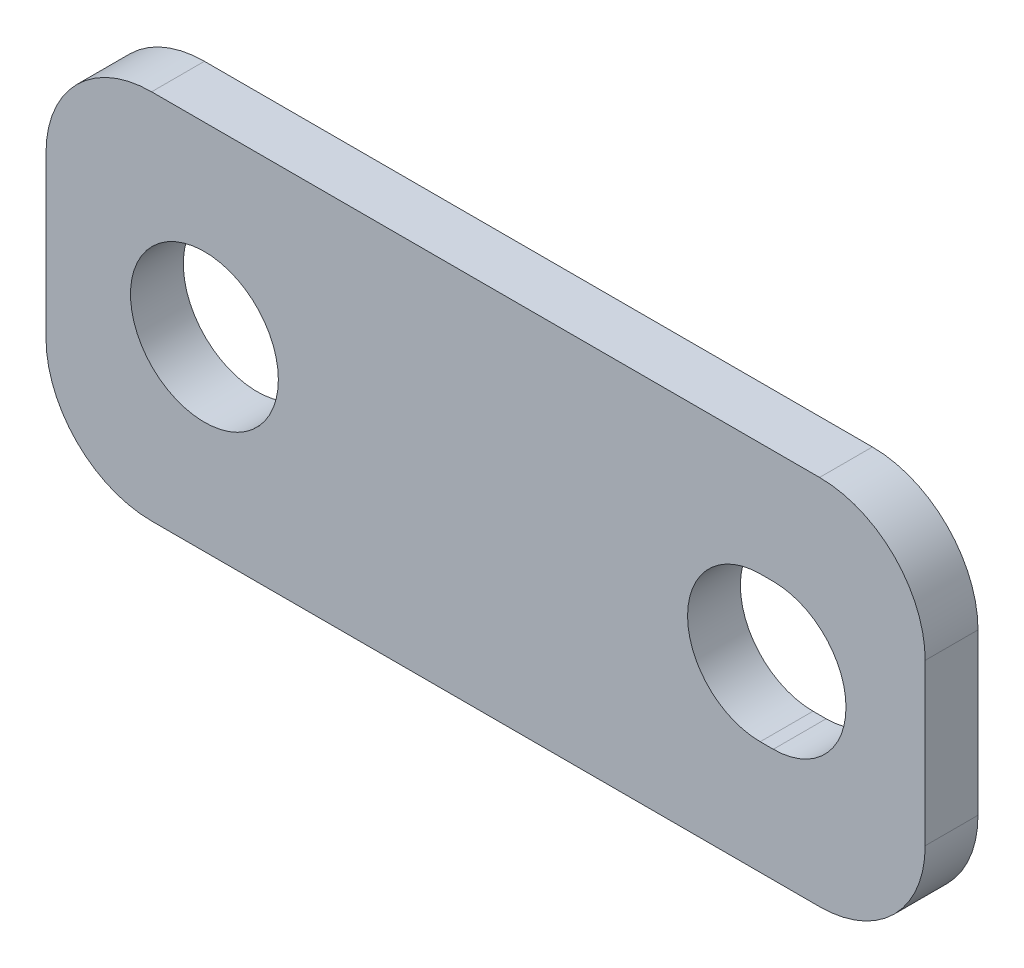
ISO-10303-21;
HEADER;
FILE_DESCRIPTION(('STEP AP214'),'2;1');
FILE_NAME('part.step','',(''),(''),'','','');
FILE_SCHEMA(('AUTOMOTIVE_DESIGN { 1 0 10303 214 1 1 1 1 }'));
ENDSEC;
DATA;
#1=APPLICATION_CONTEXT('core data for automotive mechanical design processes');
#2=APPLICATION_PROTOCOL_DEFINITION('international standard','automotive_design',2000,#1);
#3=PRODUCT_CONTEXT('',#1,'mechanical');
#4=PRODUCT('Part','Part','',(#3));
#5=PRODUCT_RELATED_PRODUCT_CATEGORY('part','',(#4));
#6=PRODUCT_DEFINITION_FORMATION('','',#4);
#7=PRODUCT_DEFINITION_CONTEXT('part definition',#1,'design');
#8=PRODUCT_DEFINITION('design','',#6,#7);
#9=PRODUCT_DEFINITION_SHAPE('','',#8);
#10=(LENGTH_UNIT() NAMED_UNIT(*) SI_UNIT(.MILLI.,.METRE.));
#11=(NAMED_UNIT(*) PLANE_ANGLE_UNIT() SI_UNIT($,.RADIAN.));
#12=(NAMED_UNIT(*) SI_UNIT($,.STERADIAN.) SOLID_ANGLE_UNIT());
#13=UNCERTAINTY_MEASURE_WITH_UNIT(LENGTH_MEASURE(1.E-05),#10,'distance_accuracy_value','');
#14=(GEOMETRIC_REPRESENTATION_CONTEXT(3) GLOBAL_UNCERTAINTY_ASSIGNED_CONTEXT((#13)) GLOBAL_UNIT_ASSIGNED_CONTEXT((#10,
#11,#12)) REPRESENTATION_CONTEXT('',''));
#15=CARTESIAN_POINT('',(0.,0.,0.));
#16=DIRECTION('',(0.,0.,1.));
#17=DIRECTION('',(1.,0.,0.));
#18=AXIS2_PLACEMENT_3D('',#15,#16,#17);
#19=CARTESIAN_POINT('',(0.,0.,-3.175));
#20=DIRECTION('',(-1.,0.,0.));
#21=DIRECTION('',(0.,0.,1.));
#22=AXIS2_PLACEMENT_3D('',#19,#20,#21);
#23=PLANE('',#22);
#24=DIRECTION('',(0.,-1.,0.));
#25=VECTOR('',#24,1.);
#26=CARTESIAN_POINT('',(0.,0.,0.));
#27=LINE('',#26,#25);
#28=CARTESIAN_POINT('',(0.,16.002,0.));
#29=VERTEX_POINT('',#28);
#30=CARTESIAN_POINT('',(0.,6.35,0.));
#31=VERTEX_POINT('',#30);
#32=EDGE_CURVE('E169',#29,#31,#27,.T.);
#33=ORIENTED_EDGE('',*,*,#32,.F.);
#34=DIRECTION('',(0.,0.,1.));
#35=VECTOR('',#34,1.);
#36=CARTESIAN_POINT('',(0.,16.002,-3.175));
#37=LINE('',#36,#35);
#38=CARTESIAN_POINT('',(0.,16.002,-3.175));
#39=VERTEX_POINT('',#38);
#40=EDGE_CURVE('E11',#29,#39,#37,.F.);
#41=ORIENTED_EDGE('',*,*,#40,.T.);
#42=DIRECTION('',(0.,-1.,0.));
#43=VECTOR('',#42,1.);
#44=CARTESIAN_POINT('',(0.,0.,-3.175));
#45=LINE('',#44,#43);
#46=CARTESIAN_POINT('',(0.,6.35,-3.175));
#47=VERTEX_POINT('',#46);
#48=EDGE_CURVE('E178',#39,#47,#45,.T.);
#49=ORIENTED_EDGE('',*,*,#48,.T.);
#50=DIRECTION('',(0.,0.,1.));
#51=VECTOR('',#50,1.);
#52=CARTESIAN_POINT('',(0.,6.35,-3.175));
#53=LINE('',#52,#51);
#54=EDGE_CURVE('E46',#47,#31,#53,.T.);
#55=ORIENTED_EDGE('',*,*,#54,.T.);
#56=EDGE_LOOP('',(#33,#41,#49,#55));
#57=FACE_BOUND('',#56,.T.);
#58=ADVANCED_FACE('F38',(#57),#23,.T.);
#59=CARTESIAN_POINT('',(0.,22.352,-3.175));
#60=DIRECTION('',(0.,1.,0.));
#61=DIRECTION('',(0.,0.,1.));
#62=AXIS2_PLACEMENT_3D('',#59,#60,#61);
#63=PLANE('',#62);
#64=DIRECTION('',(-1.,0.,0.));
#65=VECTOR('',#64,1.);
#66=CARTESIAN_POINT('',(0.,22.352,0.));
#67=LINE('',#66,#65);
#68=CARTESIAN_POINT('',(46.5123999999572,22.352,0.));
#69=VERTEX_POINT('',#68);
#70=CARTESIAN_POINT('',(6.35,22.352,0.));
#71=VERTEX_POINT('',#70);
#72=EDGE_CURVE('E182',#69,#71,#67,.T.);
#73=ORIENTED_EDGE('',*,*,#72,.F.);
#74=DIRECTION('',(0.,0.,1.));
#75=VECTOR('',#74,1.);
#76=CARTESIAN_POINT('',(46.5123999999572,22.352,-3.175));
#77=LINE('',#76,#75);
#78=CARTESIAN_POINT('',(46.5123999999572,22.352,-3.175));
#79=VERTEX_POINT('',#78);
#80=EDGE_CURVE('E216',#69,#79,#77,.F.);
#81=ORIENTED_EDGE('',*,*,#80,.T.);
#82=DIRECTION('',(-1.,0.,0.));
#83=VECTOR('',#82,1.);
#84=CARTESIAN_POINT('',(0.,22.352,-3.175));
#85=LINE('',#84,#83);
#86=CARTESIAN_POINT('',(6.35,22.352,-3.175));
#87=VERTEX_POINT('',#86);
#88=EDGE_CURVE('E187',#79,#87,#85,.T.);
#89=ORIENTED_EDGE('',*,*,#88,.T.);
#90=DIRECTION('',(0.,0.,1.));
#91=VECTOR('',#90,1.);
#92=CARTESIAN_POINT('',(6.35,22.352,-3.175));
#93=LINE('',#92,#91);
#94=EDGE_CURVE('E213',#87,#71,#93,.T.);
#95=ORIENTED_EDGE('',*,*,#94,.T.);
#96=EDGE_LOOP('',(#73,#81,#89,#95));
#97=FACE_BOUND('',#96,.T.);
#98=ADVANCED_FACE('F244',(#97),#63,.T.);
#99=CARTESIAN_POINT('',(52.8623999999572,0.,-3.175));
#100=DIRECTION('',(1.,0.,0.));
#101=DIRECTION('',(0.,0.,-1.));
#102=AXIS2_PLACEMENT_3D('',#99,#100,#101);
#103=PLANE('',#102);
#104=DIRECTION('',(0.,1.,0.));
#105=VECTOR('',#104,1.);
#106=CARTESIAN_POINT('',(52.8623999999572,0.,-3.175));
#107=LINE('',#106,#105);
#108=CARTESIAN_POINT('',(52.8623999999572,6.35,-3.175));
#109=VERTEX_POINT('',#108);
#110=CARTESIAN_POINT('',(52.8623999999572,16.002,-3.175));
#111=VERTEX_POINT('',#110);
#112=EDGE_CURVE('E184',#109,#111,#107,.T.);
#113=ORIENTED_EDGE('',*,*,#112,.T.);
#114=DIRECTION('',(0.,0.,1.));
#115=VECTOR('',#114,1.);
#116=CARTESIAN_POINT('',(52.8623999999572,16.002,-3.175));
#117=LINE('',#116,#115);
#118=CARTESIAN_POINT('',(52.8623999999572,16.002,0.));
#119=VERTEX_POINT('',#118);
#120=EDGE_CURVE('E202',#111,#119,#117,.T.);
#121=ORIENTED_EDGE('',*,*,#120,.T.);
#122=DIRECTION('',(0.,1.,0.));
#123=VECTOR('',#122,1.);
#124=CARTESIAN_POINT('',(52.8623999999572,0.,0.));
#125=LINE('',#124,#123);
#126=CARTESIAN_POINT('',(52.8623999999572,6.35,0.));
#127=VERTEX_POINT('',#126);
#128=EDGE_CURVE('E196',#127,#119,#125,.T.);
#129=ORIENTED_EDGE('',*,*,#128,.F.);
#130=DIRECTION('',(0.,0.,1.));
#131=VECTOR('',#130,1.);
#132=CARTESIAN_POINT('',(52.8623999999572,6.35,-3.175));
#133=LINE('',#132,#131);
#134=EDGE_CURVE('E190',#127,#109,#133,.F.);
#135=ORIENTED_EDGE('',*,*,#134,.T.);
#136=EDGE_LOOP('',(#113,#121,#129,#135));
#137=FACE_BOUND('',#136,.T.);
#138=ADVANCED_FACE('F253',(#137),#103,.T.);
#139=CARTESIAN_POINT('',(0.,0.,-3.175));
#140=DIRECTION('',(0.,-1.,0.));
#141=DIRECTION('',(0.,0.,-1.));
#142=AXIS2_PLACEMENT_3D('',#139,#140,#141);
#143=PLANE('',#142);
#144=DIRECTION('',(1.,0.,0.));
#145=VECTOR('',#144,1.);
#146=CARTESIAN_POINT('',(0.,0.,-3.175));
#147=LINE('',#146,#145);
#148=CARTESIAN_POINT('',(6.35,0.,-3.175));
#149=VERTEX_POINT('',#148);
#150=CARTESIAN_POINT('',(46.5123999999572,0.,-3.175));
#151=VERTEX_POINT('',#150);
#152=EDGE_CURVE('E181',#149,#151,#147,.T.);
#153=ORIENTED_EDGE('',*,*,#152,.T.);
#154=DIRECTION('',(0.,0.,1.));
#155=VECTOR('',#154,1.);
#156=CARTESIAN_POINT('',(46.5123999999572,0.,-3.175));
#157=LINE('',#156,#155);
#158=CARTESIAN_POINT('',(46.5123999999572,0.,0.));
#159=VERTEX_POINT('',#158);
#160=EDGE_CURVE('E226',#151,#159,#157,.T.);
#161=ORIENTED_EDGE('',*,*,#160,.T.);
#162=DIRECTION('',(1.,0.,0.));
#163=VECTOR('',#162,1.);
#164=CARTESIAN_POINT('',(0.,0.,0.));
#165=LINE('',#164,#163);
#166=CARTESIAN_POINT('',(6.35,0.,0.));
#167=VERTEX_POINT('',#166);
#168=EDGE_CURVE('E193',#167,#159,#165,.T.);
#169=ORIENTED_EDGE('',*,*,#168,.F.);
#170=DIRECTION('',(0.,0.,1.));
#171=VECTOR('',#170,1.);
#172=CARTESIAN_POINT('',(6.35,0.,-3.175));
#173=LINE('',#172,#171);
#174=EDGE_CURVE('E60',#167,#149,#173,.F.);
#175=ORIENTED_EDGE('',*,*,#174,.T.);
#176=EDGE_LOOP('',(#153,#161,#169,#175));
#177=FACE_BOUND('',#176,.T.);
#178=ADVANCED_FACE('F258',(#177),#143,.T.);
#179=CARTESIAN_POINT('',(0.,0.,-3.175));
#180=DIRECTION('',(0.,0.,-1.));
#181=DIRECTION('',(-1.,0.,0.));
#182=AXIS2_PLACEMENT_3D('',#179,#180,#181);
#183=PLANE('',#182);
#184=DIRECTION('',(1.,0.,0.));
#185=VECTOR('',#184,1.);
#186=CARTESIAN_POINT('',(0.,6.80719999999018,-3.175));
#187=LINE('',#186,#185);
#188=CARTESIAN_POINT('',(42.9436999999572,6.80719999999013,-3.175));
#189=VERTEX_POINT('',#188);
#190=CARTESIAN_POINT('',(43.7310999999572,6.80719999999013,-3.175));
#191=VERTEX_POINT('',#190);
#192=EDGE_CURVE('E132',#189,#191,#187,.T.);
#193=ORIENTED_EDGE('',*,*,#192,.T.);
#194=CARTESIAN_POINT('',(43.7310999999572,11.1759999999901,-3.175));
#195=DIRECTION('',(0.,0.,1.));
#196=DIRECTION('',(1.,0.,0.));
#197=AXIS2_PLACEMENT_3D('',#194,#195,#196);
#198=CIRCLE('',#197,4.3688);
#199=CARTESIAN_POINT('',(43.7310999999572,15.5447999999901,-3.175));
#200=VERTEX_POINT('',#199);
#201=EDGE_CURVE('E144',#191,#200,#198,.T.);
#202=ORIENTED_EDGE('',*,*,#201,.T.);
#203=DIRECTION('',(-1.,0.,0.));
#204=VECTOR('',#203,1.);
#205=CARTESIAN_POINT('',(1.02740396835208E-13,15.5447999999904,-3.175));
#206=LINE('',#205,#204);
#207=CARTESIAN_POINT('',(42.9436999999572,15.5447999999901,-3.175));
#208=VERTEX_POINT('',#207);
#209=EDGE_CURVE('E148',#200,#208,#206,.T.);
#210=ORIENTED_EDGE('',*,*,#209,.T.);
#211=CARTESIAN_POINT('',(42.9436999999572,11.1759999999901,-3.175));
#212=DIRECTION('',(0.,0.,1.));
#213=DIRECTION('',(1.,0.,0.));
#214=AXIS2_PLACEMENT_3D('',#211,#212,#213);
#215=CIRCLE('',#214,4.3688);
#216=EDGE_CURVE('E140',#208,#189,#215,.T.);
#217=ORIENTED_EDGE('',*,*,#216,.T.);
#218=EDGE_LOOP('',(#193,#202,#210,#217));
#219=FACE_BOUND('',#218,.T.);
#220=CARTESIAN_POINT('',(9.525,11.176,-3.175));
#221=DIRECTION('',(0.,0.,1.));
#222=DIRECTION('',(1.,0.,0.));
#223=AXIS2_PLACEMENT_3D('',#220,#221,#222);
#224=CIRCLE('',#223,4.445);
#225=CARTESIAN_POINT('',(13.97,11.176,-3.175));
#226=VERTEX_POINT('',#225);
#227=EDGE_CURVE('E163',#226,#226,#224,.T.);
#228=ORIENTED_EDGE('',*,*,#227,.T.);
#229=EDGE_LOOP('',(#228));
#230=FACE_BOUND('',#229,.T.);
#231=ORIENTED_EDGE('',*,*,#88,.F.);
#232=CARTESIAN_POINT('',(46.5123999999572,16.002,-3.175));
#233=DIRECTION('',(0.,0.,-1.));
#234=DIRECTION('',(-1.,0.,0.));
#235=AXIS2_PLACEMENT_3D('',#232,#233,#234);
#236=CIRCLE('',#235,6.35);
#237=EDGE_CURVE('E223',#79,#111,#236,.T.);
#238=ORIENTED_EDGE('',*,*,#237,.T.);
#239=ORIENTED_EDGE('',*,*,#112,.F.);
#240=CARTESIAN_POINT('',(46.5123999999572,6.35,-3.175));
#241=DIRECTION('',(0.,0.,-1.));
#242=DIRECTION('',(-1.,0.,0.));
#243=AXIS2_PLACEMENT_3D('',#240,#241,#242);
#244=CIRCLE('',#243,6.35);
#245=EDGE_CURVE('E53',#109,#151,#244,.T.);
#246=ORIENTED_EDGE('',*,*,#245,.T.);
#247=ORIENTED_EDGE('',*,*,#152,.F.);
#248=CARTESIAN_POINT('',(6.35,6.35,-3.175));
#249=DIRECTION('',(0.,0.,-1.));
#250=DIRECTION('',(-1.,0.,0.));
#251=AXIS2_PLACEMENT_3D('',#248,#249,#250);
#252=CIRCLE('',#251,6.35);
#253=EDGE_CURVE('E218',#149,#47,#252,.T.);
#254=ORIENTED_EDGE('',*,*,#253,.T.);
#255=ORIENTED_EDGE('',*,*,#48,.F.);
#256=CARTESIAN_POINT('',(6.35,16.002,-3.175));
#257=DIRECTION('',(0.,0.,-1.));
#258=DIRECTION('',(-1.,0.,0.));
#259=AXIS2_PLACEMENT_3D('',#256,#257,#258);
#260=CIRCLE('',#259,6.35);
#261=EDGE_CURVE('E220',#39,#87,#260,.T.);
#262=ORIENTED_EDGE('',*,*,#261,.T.);
#263=EDGE_LOOP('',(#231,#238,#239,#246,#247,#254,#255,#262));
#264=FACE_BOUND('',#263,.T.);
#265=ADVANCED_FACE('F150',(#219,#230,#264),#183,.T.);
#266=CARTESIAN_POINT('',(0.,0.,0.));
#267=DIRECTION('',(0.,0.,-1.));
#268=DIRECTION('',(-1.,0.,0.));
#269=AXIS2_PLACEMENT_3D('',#266,#267,#268);
#270=PLANE('',#269);
#271=CARTESIAN_POINT('',(43.7310999999572,11.1759999999901,0.));
#272=DIRECTION('',(0.,0.,1.));
#273=DIRECTION('',(1.,0.,0.));
#274=AXIS2_PLACEMENT_3D('',#271,#272,#273);
#275=CIRCLE('',#274,4.3688);
#276=CARTESIAN_POINT('',(43.7310999999572,6.80719999999014,0.));
#277=VERTEX_POINT('',#276);
#278=CARTESIAN_POINT('',(43.7310999999572,15.5447999999901,0.));
#279=VERTEX_POINT('',#278);
#280=EDGE_CURVE('E162',#277,#279,#275,.T.);
#281=ORIENTED_EDGE('',*,*,#280,.F.);
#282=DIRECTION('',(1.,0.,0.));
#283=VECTOR('',#282,1.);
#284=CARTESIAN_POINT('',(0.,6.80719999999018,0.));
#285=LINE('',#284,#283);
#286=CARTESIAN_POINT('',(42.9436999999572,6.80719999999013,0.));
#287=VERTEX_POINT('',#286);
#288=EDGE_CURVE('E135',#287,#277,#285,.T.);
#289=ORIENTED_EDGE('',*,*,#288,.F.);
#290=CARTESIAN_POINT('',(42.9436999999572,11.1759999999901,0.));
#291=DIRECTION('',(0.,0.,1.));
#292=DIRECTION('',(1.,0.,0.));
#293=AXIS2_PLACEMENT_3D('',#290,#291,#292);
#294=CIRCLE('',#293,4.3688);
#295=CARTESIAN_POINT('',(42.9436999999572,15.5447999999901,0.));
#296=VERTEX_POINT('',#295);
#297=EDGE_CURVE('E153',#296,#287,#294,.T.);
#298=ORIENTED_EDGE('',*,*,#297,.F.);
#299=DIRECTION('',(-1.,0.,0.));
#300=VECTOR('',#299,1.);
#301=CARTESIAN_POINT('',(1.02740396835208E-13,15.5447999999904,0.));
#302=LINE('',#301,#300);
#303=EDGE_CURVE('E156',#279,#296,#302,.T.);
#304=ORIENTED_EDGE('',*,*,#303,.F.);
#305=EDGE_LOOP('',(#281,#289,#298,#304));
#306=FACE_BOUND('',#305,.T.);
#307=CARTESIAN_POINT('',(9.525,11.176,0.));
#308=DIRECTION('',(0.,0.,1.));
#309=DIRECTION('',(1.,0.,0.));
#310=AXIS2_PLACEMENT_3D('',#307,#308,#309);
#311=CIRCLE('',#310,4.445);
#312=CARTESIAN_POINT('',(13.97,11.176,0.));
#313=VERTEX_POINT('',#312);
#314=EDGE_CURVE('E175',#313,#313,#311,.T.);
#315=ORIENTED_EDGE('',*,*,#314,.F.);
#316=EDGE_LOOP('',(#315));
#317=FACE_BOUND('',#316,.T.);
#318=ORIENTED_EDGE('',*,*,#128,.T.);
#319=CARTESIAN_POINT('',(46.5123999999572,16.002,0.));
#320=DIRECTION('',(0.,0.,-1.));
#321=DIRECTION('',(-1.,0.,0.));
#322=AXIS2_PLACEMENT_3D('',#319,#320,#321);
#323=CIRCLE('',#322,6.35);
#324=EDGE_CURVE('E211',#119,#69,#323,.F.);
#325=ORIENTED_EDGE('',*,*,#324,.T.);
#326=ORIENTED_EDGE('',*,*,#72,.T.);
#327=CARTESIAN_POINT('',(6.35,16.002,0.));
#328=DIRECTION('',(0.,0.,-1.));
#329=DIRECTION('',(-1.,0.,0.));
#330=AXIS2_PLACEMENT_3D('',#327,#328,#329);
#331=CIRCLE('',#330,6.35);
#332=EDGE_CURVE('E207',#71,#29,#331,.F.);
#333=ORIENTED_EDGE('',*,*,#332,.T.);
#334=ORIENTED_EDGE('',*,*,#32,.T.);
#335=CARTESIAN_POINT('',(6.35,6.35,0.));
#336=DIRECTION('',(0.,0.,-1.));
#337=DIRECTION('',(-1.,0.,0.));
#338=AXIS2_PLACEMENT_3D('',#335,#336,#337);
#339=CIRCLE('',#338,6.35);
#340=EDGE_CURVE('E205',#31,#167,#339,.F.);
#341=ORIENTED_EDGE('',*,*,#340,.T.);
#342=ORIENTED_EDGE('',*,*,#168,.T.);
#343=CARTESIAN_POINT('',(46.5123999999572,6.35,0.));
#344=DIRECTION('',(0.,0.,-1.));
#345=DIRECTION('',(-1.,0.,0.));
#346=AXIS2_PLACEMENT_3D('',#343,#344,#345);
#347=CIRCLE('',#346,6.35);
#348=EDGE_CURVE('E209',#159,#127,#347,.F.);
#349=ORIENTED_EDGE('',*,*,#348,.T.);
#350=EDGE_LOOP('',(#318,#325,#326,#333,#334,#341,#342,#349));
#351=FACE_BOUND('',#350,.T.);
#352=ADVANCED_FACE('F237',(#306,#317,#351),#270,.F.);
#353=CARTESIAN_POINT('',(9.525,11.176,-3.175));
#354=DIRECTION('',(0.,0.,1.));
#355=DIRECTION('',(1.,0.,0.));
#356=AXIS2_PLACEMENT_3D('',#353,#354,#355);
#357=CYLINDRICAL_SURFACE('',#356,4.445);
#358=ORIENTED_EDGE('',*,*,#227,.F.);
#359=EDGE_LOOP('',(#358));
#360=FACE_BOUND('',#359,.T.);
#361=ORIENTED_EDGE('',*,*,#314,.T.);
#362=EDGE_LOOP('',(#361));
#363=FACE_BOUND('',#362,.T.);
#364=ADVANCED_FACE('F336',(#360,#363),#357,.F.);
#365=CARTESIAN_POINT('',(0.,6.80719999999018,-3.175));
#366=DIRECTION('',(0.,-1.,0.));
#367=DIRECTION('',(1.,0.,0.));
#368=AXIS2_PLACEMENT_3D('',#365,#366,#367);
#369=PLANE('',#368);
#370=ORIENTED_EDGE('',*,*,#288,.T.);
#371=DIRECTION('',(0.,0.,1.));
#372=VECTOR('',#371,1.);
#373=CARTESIAN_POINT('',(43.7310999999572,6.80719999999013,-3.175));
#374=LINE('',#373,#372);
#375=EDGE_CURVE('E128',#191,#277,#374,.T.);
#376=ORIENTED_EDGE('',*,*,#375,.F.);
#377=ORIENTED_EDGE('',*,*,#192,.F.);
#378=DIRECTION('',(0.,0.,1.));
#379=VECTOR('',#378,1.);
#380=CARTESIAN_POINT('',(42.9436999999572,6.80719999999013,-3.175));
#381=LINE('',#380,#379);
#382=EDGE_CURVE('E167',#189,#287,#381,.T.);
#383=ORIENTED_EDGE('',*,*,#382,.T.);
#384=EDGE_LOOP('',(#370,#376,#377,#383));
#385=FACE_BOUND('',#384,.T.);
#386=ADVANCED_FACE('F130',(#385),#369,.F.);
#387=CARTESIAN_POINT('',(42.9436999999572,11.1759999999901,-3.175));
#388=DIRECTION('',(0.,0.,1.));
#389=DIRECTION('',(1.,0.,0.));
#390=AXIS2_PLACEMENT_3D('',#387,#388,#389);
#391=CYLINDRICAL_SURFACE('',#390,4.3688);
#392=ORIENTED_EDGE('',*,*,#297,.T.);
#393=ORIENTED_EDGE('',*,*,#382,.F.);
#394=ORIENTED_EDGE('',*,*,#216,.F.);
#395=DIRECTION('',(0.,0.,1.));
#396=VECTOR('',#395,1.);
#397=CARTESIAN_POINT('',(42.9436999999572,15.5447999999901,-3.175));
#398=LINE('',#397,#396);
#399=EDGE_CURVE('E170',#208,#296,#398,.T.);
#400=ORIENTED_EDGE('',*,*,#399,.T.);
#401=EDGE_LOOP('',(#392,#393,#394,#400));
#402=FACE_BOUND('',#401,.T.);
#403=ADVANCED_FACE('F315',(#402),#391,.F.);
#404=CARTESIAN_POINT('',(1.02740396835208E-13,15.5447999999904,-3.175));
#405=DIRECTION('',(0.,1.,0.));
#406=DIRECTION('',(-1.,0.,0.));
#407=AXIS2_PLACEMENT_3D('',#404,#405,#406);
#408=PLANE('',#407);
#409=ORIENTED_EDGE('',*,*,#303,.T.);
#410=ORIENTED_EDGE('',*,*,#399,.F.);
#411=ORIENTED_EDGE('',*,*,#209,.F.);
#412=DIRECTION('',(0.,0.,1.));
#413=VECTOR('',#412,1.);
#414=CARTESIAN_POINT('',(43.7310999999572,15.5447999999901,-3.175));
#415=LINE('',#414,#413);
#416=EDGE_CURVE('E139',#200,#279,#415,.T.);
#417=ORIENTED_EDGE('',*,*,#416,.T.);
#418=EDGE_LOOP('',(#409,#410,#411,#417));
#419=FACE_BOUND('',#418,.T.);
#420=ADVANCED_FACE('F305',(#419),#408,.F.);
#421=CARTESIAN_POINT('',(43.7310999999572,11.1759999999901,-3.175));
#422=DIRECTION('',(0.,0.,1.));
#423=DIRECTION('',(1.,0.,0.));
#424=AXIS2_PLACEMENT_3D('',#421,#422,#423);
#425=CYLINDRICAL_SURFACE('',#424,4.3688);
#426=ORIENTED_EDGE('',*,*,#280,.T.);
#427=ORIENTED_EDGE('',*,*,#416,.F.);
#428=ORIENTED_EDGE('',*,*,#201,.F.);
#429=ORIENTED_EDGE('',*,*,#375,.T.);
#430=EDGE_LOOP('',(#426,#427,#428,#429));
#431=FACE_BOUND('',#430,.T.);
#432=ADVANCED_FACE('F145',(#431),#425,.F.);
#433=CARTESIAN_POINT('',(46.5123999999572,16.002,-3.175));
#434=DIRECTION('',(0.,0.,1.));
#435=DIRECTION('',(1.,0.,0.));
#436=AXIS2_PLACEMENT_3D('',#433,#434,#435);
#437=CYLINDRICAL_SURFACE('',#436,6.35);
#438=ORIENTED_EDGE('',*,*,#237,.F.);
#439=ORIENTED_EDGE('',*,*,#80,.F.);
#440=ORIENTED_EDGE('',*,*,#324,.F.);
#441=ORIENTED_EDGE('',*,*,#120,.F.);
#442=EDGE_LOOP('',(#438,#439,#440,#441));
#443=FACE_BOUND('',#442,.T.);
#444=ADVANCED_FACE('F250',(#443),#437,.T.);
#445=CARTESIAN_POINT('',(46.5123999999572,6.35,-3.175));
#446=DIRECTION('',(0.,0.,1.));
#447=DIRECTION('',(1.,0.,0.));
#448=AXIS2_PLACEMENT_3D('',#445,#446,#447);
#449=CYLINDRICAL_SURFACE('',#448,6.35);
#450=ORIENTED_EDGE('',*,*,#245,.F.);
#451=ORIENTED_EDGE('',*,*,#134,.F.);
#452=ORIENTED_EDGE('',*,*,#348,.F.);
#453=ORIENTED_EDGE('',*,*,#160,.F.);
#454=EDGE_LOOP('',(#450,#451,#452,#453));
#455=FACE_BOUND('',#454,.T.);
#456=ADVANCED_FACE('F257',(#455),#449,.T.);
#457=CARTESIAN_POINT('',(6.35,16.002,-3.175));
#458=DIRECTION('',(0.,0.,1.));
#459=DIRECTION('',(1.,0.,0.));
#460=AXIS2_PLACEMENT_3D('',#457,#458,#459);
#461=CYLINDRICAL_SURFACE('',#460,6.35);
#462=ORIENTED_EDGE('',*,*,#261,.F.);
#463=ORIENTED_EDGE('',*,*,#40,.F.);
#464=ORIENTED_EDGE('',*,*,#332,.F.);
#465=ORIENTED_EDGE('',*,*,#94,.F.);
#466=EDGE_LOOP('',(#462,#463,#464,#465));
#467=FACE_BOUND('',#466,.T.);
#468=ADVANCED_FACE('F242',(#467),#461,.T.);
#469=CARTESIAN_POINT('',(6.35,6.35,-3.175));
#470=DIRECTION('',(0.,0.,1.));
#471=DIRECTION('',(1.,0.,0.));
#472=AXIS2_PLACEMENT_3D('',#469,#470,#471);
#473=CYLINDRICAL_SURFACE('',#472,6.35);
#474=ORIENTED_EDGE('',*,*,#253,.F.);
#475=ORIENTED_EDGE('',*,*,#174,.F.);
#476=ORIENTED_EDGE('',*,*,#340,.F.);
#477=ORIENTED_EDGE('',*,*,#54,.F.);
#478=EDGE_LOOP('',(#474,#475,#476,#477));
#479=FACE_BOUND('',#478,.T.);
#480=ADVANCED_FACE('F40',(#479),#473,.T.);
#481=CLOSED_SHELL('',(#58,#98,#138,#178,#265,#352,#364,#386,#403,#420,#432,#444,#456,#468,#480));
#482=MANIFOLD_SOLID_BREP('B2',#481);
#483=ADVANCED_BREP_SHAPE_REPRESENTATION('',(#18,#482),#14);
#484=SHAPE_DEFINITION_REPRESENTATION(#9,#483);
ENDSEC;
END-ISO-10303-21;
